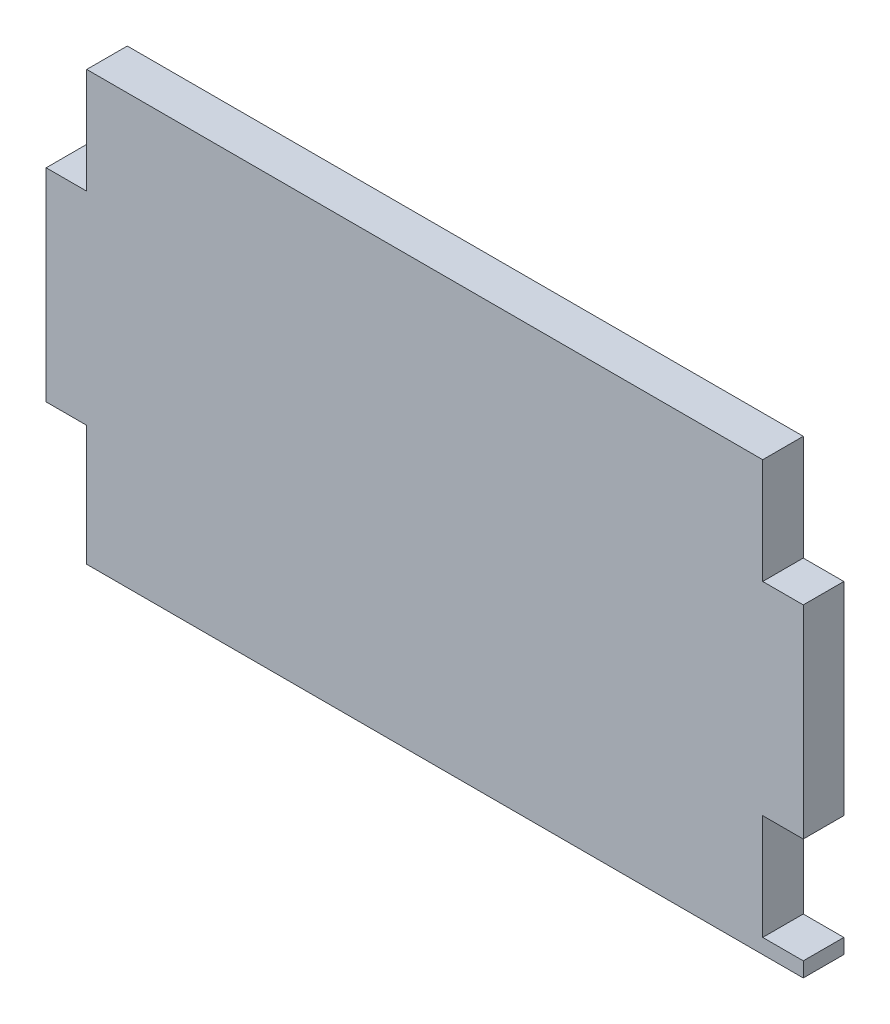
ISO-10303-21;
HEADER;
FILE_DESCRIPTION(('STEP AP214'),'2;1');
FILE_NAME('part.step','',(''),(''),'','','');
FILE_SCHEMA(('AUTOMOTIVE_DESIGN { 1 0 10303 214 1 1 1 1 }'));
ENDSEC;
DATA;
#1=APPLICATION_CONTEXT('core data for automotive mechanical design processes');
#2=APPLICATION_PROTOCOL_DEFINITION('international standard','automotive_design',2000,#1);
#3=PRODUCT_CONTEXT('',#1,'mechanical');
#4=PRODUCT('Part','Part','',(#3));
#5=PRODUCT_RELATED_PRODUCT_CATEGORY('part','',(#4));
#6=PRODUCT_DEFINITION_FORMATION('','',#4);
#7=PRODUCT_DEFINITION_CONTEXT('part definition',#1,'design');
#8=PRODUCT_DEFINITION('design','',#6,#7);
#9=PRODUCT_DEFINITION_SHAPE('','',#8);
#10=(LENGTH_UNIT() NAMED_UNIT(*) SI_UNIT(.MILLI.,.METRE.));
#11=(NAMED_UNIT(*) PLANE_ANGLE_UNIT() SI_UNIT($,.RADIAN.));
#12=(NAMED_UNIT(*) SI_UNIT($,.STERADIAN.) SOLID_ANGLE_UNIT());
#13=UNCERTAINTY_MEASURE_WITH_UNIT(LENGTH_MEASURE(1.E-05),#10,'distance_accuracy_value','');
#14=(GEOMETRIC_REPRESENTATION_CONTEXT(3) GLOBAL_UNCERTAINTY_ASSIGNED_CONTEXT((#13)) GLOBAL_UNIT_ASSIGNED_CONTEXT((#10,
#11,#12)) REPRESENTATION_CONTEXT('',''));
#15=CARTESIAN_POINT('',(0.,0.,0.));
#16=DIRECTION('',(0.,0.,1.));
#17=DIRECTION('',(1.,0.,0.));
#18=AXIS2_PLACEMENT_3D('',#15,#16,#17);
#19=CARTESIAN_POINT('',(15.0065393518519,16.5420138888889,3.));
#20=DIRECTION('',(-1.,0.,0.));
#21=DIRECTION('',(0.,-1.,0.));
#22=AXIS2_PLACEMENT_3D('',#19,#20,#21);
#23=PLANE('',#22);
#24=DIRECTION('',(0.,1.,0.));
#25=VECTOR('',#24,1.);
#26=CARTESIAN_POINT('',(15.0065393518519,16.5420138888889,3.));
#27=LINE('',#26,#25);
#28=CARTESIAN_POINT('',(15.0065393518519,-6.25798611111111,3.));
#29=VERTEX_POINT('',#28);
#30=CARTESIAN_POINT('',(15.0065393518519,8.74201388888889,3.));
#31=VERTEX_POINT('',#30);
#32=EDGE_CURVE('E160',#29,#31,#27,.T.);
#33=ORIENTED_EDGE('',*,*,#32,.F.);
#34=DIRECTION('',(0.,0.,1.));
#35=VECTOR('',#34,1.);
#36=CARTESIAN_POINT('',(15.0065393518519,-6.25798611111111,0.));
#37=LINE('',#36,#35);
#38=CARTESIAN_POINT('',(15.0065393518519,-6.25798611111111,0.));
#39=VERTEX_POINT('',#38);
#40=EDGE_CURVE('E227',#39,#29,#37,.T.);
#41=ORIENTED_EDGE('',*,*,#40,.F.);
#42=DIRECTION('',(0.,1.,0.));
#43=VECTOR('',#42,1.);
#44=CARTESIAN_POINT('',(15.0065393518519,16.5420138888889,0.));
#45=LINE('',#44,#43);
#46=CARTESIAN_POINT('',(15.0065393518519,8.74201388888889,0.));
#47=VERTEX_POINT('',#46);
#48=EDGE_CURVE('E56',#39,#47,#45,.T.);
#49=ORIENTED_EDGE('',*,*,#48,.T.);
#50=DIRECTION('',(0.,0.,1.));
#51=VECTOR('',#50,1.);
#52=CARTESIAN_POINT('',(15.0065393518519,8.74201388888889,0.));
#53=LINE('',#52,#51);
#54=EDGE_CURVE('E234',#47,#31,#53,.T.);
#55=ORIENTED_EDGE('',*,*,#54,.T.);
#56=EDGE_LOOP('',(#33,#41,#49,#55));
#57=FACE_BOUND('',#56,.T.);
#58=ADVANCED_FACE('F33',(#57),#23,.F.);
#59=CARTESIAN_POINT('',(-40.9934606481482,16.5420138888889,3.));
#60=DIRECTION('',(1.,0.,0.));
#61=DIRECTION('',(0.,0.,-1.));
#62=AXIS2_PLACEMENT_3D('',#59,#60,#61);
#63=PLANE('',#62);
#64=DIRECTION('',(0.,-1.,0.));
#65=VECTOR('',#64,1.);
#66=CARTESIAN_POINT('',(-40.9934606481482,16.5420138888889,0.));
#67=LINE('',#66,#65);
#68=CARTESIAN_POINT('',(-40.9934606481482,8.74201388888889,0.));
#69=VERTEX_POINT('',#68);
#70=CARTESIAN_POINT('',(-40.9934606481482,-6.25798611111111,0.));
#71=VERTEX_POINT('',#70);
#72=EDGE_CURVE('E170',#69,#71,#67,.T.);
#73=ORIENTED_EDGE('',*,*,#72,.T.);
#74=DIRECTION('',(0.,0.,1.));
#75=VECTOR('',#74,1.);
#76=CARTESIAN_POINT('',(-40.9934606481482,-6.25798611111111,0.));
#77=LINE('',#76,#75);
#78=CARTESIAN_POINT('',(-40.9934606481482,-6.25798611111111,3.));
#79=VERTEX_POINT('',#78);
#80=EDGE_CURVE('E209',#71,#79,#77,.T.);
#81=ORIENTED_EDGE('',*,*,#80,.T.);
#82=DIRECTION('',(0.,-1.,0.));
#83=VECTOR('',#82,1.);
#84=CARTESIAN_POINT('',(-40.9934606481482,16.5420138888889,3.));
#85=LINE('',#84,#83);
#86=CARTESIAN_POINT('',(-40.9934606481482,8.74201388888889,3.));
#87=VERTEX_POINT('',#86);
#88=EDGE_CURVE('E161',#87,#79,#85,.T.);
#89=ORIENTED_EDGE('',*,*,#88,.F.);
#90=DIRECTION('',(0.,0.,1.));
#91=VECTOR('',#90,1.);
#92=CARTESIAN_POINT('',(-40.9934606481482,8.74201388888889,0.));
#93=LINE('',#92,#91);
#94=EDGE_CURVE('E201',#69,#87,#93,.T.);
#95=ORIENTED_EDGE('',*,*,#94,.F.);
#96=EDGE_LOOP('',(#73,#81,#89,#95));
#97=FACE_BOUND('',#96,.T.);
#98=ADVANCED_FACE('F35',(#97),#63,.F.);
#99=CARTESIAN_POINT('',(-40.9934606481482,-15.1579861111111,3.));
#100=DIRECTION('',(0.,1.,0.));
#101=DIRECTION('',(0.,0.,1.));
#102=AXIS2_PLACEMENT_3D('',#99,#100,#101);
#103=PLANE('',#102);
#104=DIRECTION('',(1.,0.,0.));
#105=VECTOR('',#104,1.);
#106=CARTESIAN_POINT('',(-40.9934606481482,-15.1579861111111,3.));
#107=LINE('',#106,#105);
#108=CARTESIAN_POINT('',(-37.9934606481481,-15.1579861111111,3.));
#109=VERTEX_POINT('',#108);
#110=CARTESIAN_POINT('',(15.0065393518519,-15.1579861111111,3.));
#111=VERTEX_POINT('',#110);
#112=EDGE_CURVE('E142',#109,#111,#107,.T.);
#113=ORIENTED_EDGE('',*,*,#112,.F.);
#114=DIRECTION('',(0.,0.,1.));
#115=VECTOR('',#114,1.);
#116=CARTESIAN_POINT('',(-37.9934606481481,-15.1579861111111,-7.));
#117=LINE('',#116,#115);
#118=CARTESIAN_POINT('',(-37.9934606481481,-15.1579861111111,0.));
#119=VERTEX_POINT('',#118);
#120=EDGE_CURVE('E150',#119,#109,#117,.T.);
#121=ORIENTED_EDGE('',*,*,#120,.F.);
#122=DIRECTION('',(1.,0.,0.));
#123=VECTOR('',#122,1.);
#124=CARTESIAN_POINT('',(-40.9934606481482,-15.1579861111111,0.));
#125=LINE('',#124,#123);
#126=CARTESIAN_POINT('',(15.0065393518519,-15.1579861111111,0.));
#127=VERTEX_POINT('',#126);
#128=EDGE_CURVE('E173',#119,#127,#125,.T.);
#129=ORIENTED_EDGE('',*,*,#128,.T.);
#130=DIRECTION('',(0.,0.,-1.));
#131=VECTOR('',#130,1.);
#132=CARTESIAN_POINT('',(15.0065393518519,-15.1579861111111,3.));
#133=LINE('',#132,#131);
#134=EDGE_CURVE('E11',#111,#127,#133,.T.);
#135=ORIENTED_EDGE('',*,*,#134,.F.);
#136=EDGE_LOOP('',(#113,#121,#129,#135));
#137=FACE_BOUND('',#136,.T.);
#138=ADVANCED_FACE('F158',(#137),#103,.F.);
#139=CARTESIAN_POINT('',(15.0065393518519,-14.0579861111111,0.));
#140=VERTEX_POINT('',#139);
#141=EDGE_CURVE('E176',#127,#140,#45,.T.);
#142=ORIENTED_EDGE('',*,*,#141,.T.);
#143=DIRECTION('',(0.,0.,1.));
#144=VECTOR('',#143,1.);
#145=CARTESIAN_POINT('',(15.0065393518519,-14.0579861111111,0.));
#146=LINE('',#145,#144);
#147=CARTESIAN_POINT('',(15.0065393518519,-14.0579861111111,3.));
#148=VERTEX_POINT('',#147);
#149=EDGE_CURVE('E48',#140,#148,#146,.T.);
#150=ORIENTED_EDGE('',*,*,#149,.T.);
#151=EDGE_CURVE('E163',#111,#148,#27,.T.);
#152=ORIENTED_EDGE('',*,*,#151,.F.);
#153=ORIENTED_EDGE('',*,*,#134,.T.);
#154=EDGE_LOOP('',(#142,#150,#152,#153));
#155=FACE_BOUND('',#154,.T.);
#156=ADVANCED_FACE('F250',(#155),#23,.F.);
#157=CARTESIAN_POINT('',(-40.9934606481482,16.5420138888889,3.));
#158=DIRECTION('',(0.,-1.,0.));
#159=DIRECTION('',(0.,0.,-1.));
#160=AXIS2_PLACEMENT_3D('',#157,#158,#159);
#161=PLANE('',#160);
#162=DIRECTION('',(-1.,0.,0.));
#163=VECTOR('',#162,1.);
#164=CARTESIAN_POINT('',(-40.9934606481482,16.5420138888889,3.));
#165=LINE('',#164,#163);
#166=CARTESIAN_POINT('',(12.0065393518519,16.5420138888889,3.));
#167=VERTEX_POINT('',#166);
#168=CARTESIAN_POINT('',(-37.9934606481481,16.5420138888889,3.));
#169=VERTEX_POINT('',#168);
#170=EDGE_CURVE('E41',#167,#169,#165,.T.);
#171=ORIENTED_EDGE('',*,*,#170,.F.);
#172=DIRECTION('',(0.,0.,1.));
#173=VECTOR('',#172,1.);
#174=CARTESIAN_POINT('',(12.0065393518519,16.5420138888889,0.));
#175=LINE('',#174,#173);
#176=CARTESIAN_POINT('',(12.0065393518519,16.5420138888889,0.));
#177=VERTEX_POINT('',#176);
#178=EDGE_CURVE('E147',#177,#167,#175,.T.);
#179=ORIENTED_EDGE('',*,*,#178,.F.);
#180=DIRECTION('',(-1.,0.,0.));
#181=VECTOR('',#180,1.);
#182=CARTESIAN_POINT('',(-40.9934606481482,16.5420138888889,0.));
#183=LINE('',#182,#181);
#184=CARTESIAN_POINT('',(-37.9934606481481,16.5420138888889,0.));
#185=VERTEX_POINT('',#184);
#186=EDGE_CURVE('E165',#177,#185,#183,.T.);
#187=ORIENTED_EDGE('',*,*,#186,.T.);
#188=DIRECTION('',(0.,0.,1.));
#189=VECTOR('',#188,1.);
#190=CARTESIAN_POINT('',(-37.9934606481481,16.5420138888889,0.));
#191=LINE('',#190,#189);
#192=EDGE_CURVE('E174',#185,#169,#191,.T.);
#193=ORIENTED_EDGE('',*,*,#192,.T.);
#194=EDGE_LOOP('',(#171,#179,#187,#193));
#195=FACE_BOUND('',#194,.T.);
#196=ADVANCED_FACE('F184',(#195),#161,.F.);
#197=CARTESIAN_POINT('',(0.,0.,3.));
#198=DIRECTION('',(0.,0.,1.));
#199=DIRECTION('',(1.,0.,0.));
#200=AXIS2_PLACEMENT_3D('',#197,#198,#199);
#201=PLANE('',#200);
#202=DIRECTION('',(0.,1.,0.));
#203=VECTOR('',#202,1.);
#204=CARTESIAN_POINT('',(-37.9934606481481,-6.25798611111111,3.));
#205=LINE('',#204,#203);
#206=CARTESIAN_POINT('',(-37.9934606481481,-6.25798611111111,3.));
#207=VERTEX_POINT('',#206);
#208=EDGE_CURVE('E137',#109,#207,#205,.T.);
#209=ORIENTED_EDGE('',*,*,#208,.F.);
#210=ORIENTED_EDGE('',*,*,#112,.T.);
#211=ORIENTED_EDGE('',*,*,#151,.T.);
#212=DIRECTION('',(1.,0.,0.));
#213=VECTOR('',#212,1.);
#214=CARTESIAN_POINT('',(12.0065393518519,-14.0579861111111,3.));
#215=LINE('',#214,#213);
#216=CARTESIAN_POINT('',(12.0065393518519,-14.0579861111111,3.));
#217=VERTEX_POINT('',#216);
#218=EDGE_CURVE('E253',#217,#148,#215,.T.);
#219=ORIENTED_EDGE('',*,*,#218,.F.);
#220=DIRECTION('',(0.,-1.,0.));
#221=VECTOR('',#220,1.);
#222=CARTESIAN_POINT('',(12.0065393518519,-6.25798611111111,3.));
#223=LINE('',#222,#221);
#224=CARTESIAN_POINT('',(12.0065393518519,-6.25798611111111,3.));
#225=VERTEX_POINT('',#224);
#226=EDGE_CURVE('E156',#225,#217,#223,.T.);
#227=ORIENTED_EDGE('',*,*,#226,.F.);
#228=DIRECTION('',(-1.,0.,0.));
#229=VECTOR('',#228,1.);
#230=CARTESIAN_POINT('',(12.0065393518519,-6.25798611111111,3.));
#231=LINE('',#230,#229);
#232=EDGE_CURVE('E256',#29,#225,#231,.T.);
#233=ORIENTED_EDGE('',*,*,#232,.F.);
#234=ORIENTED_EDGE('',*,*,#32,.T.);
#235=DIRECTION('',(1.,0.,0.));
#236=VECTOR('',#235,1.);
#237=CARTESIAN_POINT('',(12.0065393518519,8.74201388888889,3.));
#238=LINE('',#237,#236);
#239=CARTESIAN_POINT('',(12.0065393518519,8.74201388888889,3.));
#240=VERTEX_POINT('',#239);
#241=EDGE_CURVE('E221',#240,#31,#238,.T.);
#242=ORIENTED_EDGE('',*,*,#241,.F.);
#243=DIRECTION('',(0.,-1.,0.));
#244=VECTOR('',#243,1.);
#245=CARTESIAN_POINT('',(12.0065393518519,16.5420138888889,3.));
#246=LINE('',#245,#244);
#247=EDGE_CURVE('E219',#167,#240,#246,.T.);
#248=ORIENTED_EDGE('',*,*,#247,.F.);
#249=ORIENTED_EDGE('',*,*,#170,.T.);
#250=DIRECTION('',(0.,1.,0.));
#251=VECTOR('',#250,1.);
#252=CARTESIAN_POINT('',(-37.9934606481481,16.5420138888889,3.));
#253=LINE('',#252,#251);
#254=CARTESIAN_POINT('',(-37.9934606481481,8.74201388888889,3.));
#255=VERTEX_POINT('',#254);
#256=EDGE_CURVE('E194',#255,#169,#253,.T.);
#257=ORIENTED_EDGE('',*,*,#256,.F.);
#258=DIRECTION('',(1.,0.,0.));
#259=VECTOR('',#258,1.);
#260=CARTESIAN_POINT('',(-40.9934606481482,8.74201388888889,3.));
#261=LINE('',#260,#259);
#262=EDGE_CURVE('E206',#87,#255,#261,.T.);
#263=ORIENTED_EDGE('',*,*,#262,.F.);
#264=ORIENTED_EDGE('',*,*,#88,.T.);
#265=DIRECTION('',(-1.,0.,0.));
#266=VECTOR('',#265,1.);
#267=CARTESIAN_POINT('',(-40.9934606481482,-6.25798611111111,3.));
#268=LINE('',#267,#266);
#269=EDGE_CURVE('E145',#207,#79,#268,.T.);
#270=ORIENTED_EDGE('',*,*,#269,.F.);
#271=EDGE_LOOP('',(#209,#210,#211,#219,#227,#233,#234,#242,#248,#249,#257,#263,#264,#270));
#272=FACE_BOUND('',#271,.T.);
#273=ADVANCED_FACE('F139',(#272),#201,.T.);
#274=CARTESIAN_POINT('',(0.,0.,0.));
#275=DIRECTION('',(0.,0.,1.));
#276=DIRECTION('',(1.,0.,0.));
#277=AXIS2_PLACEMENT_3D('',#274,#275,#276);
#278=PLANE('',#277);
#279=ORIENTED_EDGE('',*,*,#128,.F.);
#280=DIRECTION('',(0.,1.,0.));
#281=VECTOR('',#280,1.);
#282=CARTESIAN_POINT('',(-37.9934606481481,-6.25798611111111,0.));
#283=LINE('',#282,#281);
#284=CARTESIAN_POINT('',(-37.9934606481481,-6.25798611111111,0.));
#285=VERTEX_POINT('',#284);
#286=EDGE_CURVE('E153',#119,#285,#283,.T.);
#287=ORIENTED_EDGE('',*,*,#286,.T.);
#288=DIRECTION('',(-1.,0.,0.));
#289=VECTOR('',#288,1.);
#290=CARTESIAN_POINT('',(-40.9934606481482,-6.25798611111111,0.));
#291=LINE('',#290,#289);
#292=EDGE_CURVE('E239',#285,#71,#291,.T.);
#293=ORIENTED_EDGE('',*,*,#292,.T.);
#294=ORIENTED_EDGE('',*,*,#72,.F.);
#295=DIRECTION('',(1.,0.,0.));
#296=VECTOR('',#295,1.);
#297=CARTESIAN_POINT('',(-40.9934606481482,8.74201388888889,0.));
#298=LINE('',#297,#296);
#299=CARTESIAN_POINT('',(-37.9934606481481,8.74201388888889,0.));
#300=VERTEX_POINT('',#299);
#301=EDGE_CURVE('E200',#69,#300,#298,.T.);
#302=ORIENTED_EDGE('',*,*,#301,.T.);
#303=DIRECTION('',(0.,1.,0.));
#304=VECTOR('',#303,1.);
#305=CARTESIAN_POINT('',(-37.9934606481481,16.5420138888889,0.));
#306=LINE('',#305,#304);
#307=EDGE_CURVE('E191',#300,#185,#306,.T.);
#308=ORIENTED_EDGE('',*,*,#307,.T.);
#309=ORIENTED_EDGE('',*,*,#186,.F.);
#310=DIRECTION('',(0.,-1.,0.));
#311=VECTOR('',#310,1.);
#312=CARTESIAN_POINT('',(12.0065393518519,16.5420138888889,0.));
#313=LINE('',#312,#311);
#314=CARTESIAN_POINT('',(12.0065393518519,8.74201388888889,0.));
#315=VERTEX_POINT('',#314);
#316=EDGE_CURVE('E225',#177,#315,#313,.T.);
#317=ORIENTED_EDGE('',*,*,#316,.T.);
#318=DIRECTION('',(1.,0.,0.));
#319=VECTOR('',#318,1.);
#320=CARTESIAN_POINT('',(12.0065393518519,8.74201388888889,0.));
#321=LINE('',#320,#319);
#322=EDGE_CURVE('E230',#315,#47,#321,.T.);
#323=ORIENTED_EDGE('',*,*,#322,.T.);
#324=ORIENTED_EDGE('',*,*,#48,.F.);
#325=DIRECTION('',(-1.,0.,0.));
#326=VECTOR('',#325,1.);
#327=CARTESIAN_POINT('',(12.0065393518519,-6.25798611111111,0.));
#328=LINE('',#327,#326);
#329=CARTESIAN_POINT('',(12.0065393518519,-6.25798611111111,0.));
#330=VERTEX_POINT('',#329);
#331=EDGE_CURVE('E267',#39,#330,#328,.T.);
#332=ORIENTED_EDGE('',*,*,#331,.T.);
#333=DIRECTION('',(0.,-1.,0.));
#334=VECTOR('',#333,1.);
#335=CARTESIAN_POINT('',(12.0065393518519,-6.25798611111111,0.));
#336=LINE('',#335,#334);
#337=CARTESIAN_POINT('',(12.0065393518519,-14.0579861111111,0.));
#338=VERTEX_POINT('',#337);
#339=EDGE_CURVE('E259',#330,#338,#336,.T.);
#340=ORIENTED_EDGE('',*,*,#339,.T.);
#341=DIRECTION('',(1.,0.,0.));
#342=VECTOR('',#341,1.);
#343=CARTESIAN_POINT('',(12.0065393518519,-14.0579861111111,0.));
#344=LINE('',#343,#342);
#345=EDGE_CURVE('E278',#338,#140,#344,.T.);
#346=ORIENTED_EDGE('',*,*,#345,.T.);
#347=ORIENTED_EDGE('',*,*,#141,.F.);
#348=EDGE_LOOP('',(#279,#287,#293,#294,#302,#308,#309,#317,#323,#324,#332,#340,#346,#347));
#349=FACE_BOUND('',#348,.T.);
#350=ADVANCED_FACE('F198',(#349),#278,.F.);
#351=CARTESIAN_POINT('',(-37.9934606481481,16.5420138888889,0.));
#352=DIRECTION('',(1.,0.,0.));
#353=DIRECTION('',(0.,0.,-1.));
#354=AXIS2_PLACEMENT_3D('',#351,#352,#353);
#355=PLANE('',#354);
#356=ORIENTED_EDGE('',*,*,#256,.T.);
#357=ORIENTED_EDGE('',*,*,#192,.F.);
#358=ORIENTED_EDGE('',*,*,#307,.F.);
#359=DIRECTION('',(0.,0.,1.));
#360=VECTOR('',#359,1.);
#361=CARTESIAN_POINT('',(-37.9934606481481,8.74201388888889,0.));
#362=LINE('',#361,#360);
#363=EDGE_CURVE('E195',#300,#255,#362,.T.);
#364=ORIENTED_EDGE('',*,*,#363,.T.);
#365=EDGE_LOOP('',(#356,#357,#358,#364));
#366=FACE_BOUND('',#365,.T.);
#367=ADVANCED_FACE('F190',(#366),#355,.F.);
#368=CARTESIAN_POINT('',(-40.9934606481482,8.74201388888889,0.));
#369=DIRECTION('',(0.,-1.,0.));
#370=DIRECTION('',(0.,0.,-1.));
#371=AXIS2_PLACEMENT_3D('',#368,#369,#370);
#372=PLANE('',#371);
#373=ORIENTED_EDGE('',*,*,#262,.T.);
#374=ORIENTED_EDGE('',*,*,#363,.F.);
#375=ORIENTED_EDGE('',*,*,#301,.F.);
#376=ORIENTED_EDGE('',*,*,#94,.T.);
#377=EDGE_LOOP('',(#373,#374,#375,#376));
#378=FACE_BOUND('',#377,.T.);
#379=ADVANCED_FACE('F213',(#378),#372,.F.);
#380=CARTESIAN_POINT('',(-40.9934606481482,-6.25798611111111,0.));
#381=DIRECTION('',(0.,1.,0.));
#382=DIRECTION('',(0.,0.,1.));
#383=AXIS2_PLACEMENT_3D('',#380,#381,#382);
#384=PLANE('',#383);
#385=ORIENTED_EDGE('',*,*,#269,.T.);
#386=ORIENTED_EDGE('',*,*,#80,.F.);
#387=ORIENTED_EDGE('',*,*,#292,.F.);
#388=DIRECTION('',(0.,0.,1.));
#389=VECTOR('',#388,1.);
#390=CARTESIAN_POINT('',(-37.9934606481481,-6.25798611111111,0.));
#391=LINE('',#390,#389);
#392=EDGE_CURVE('E241',#285,#207,#391,.T.);
#393=ORIENTED_EDGE('',*,*,#392,.T.);
#394=EDGE_LOOP('',(#385,#386,#387,#393));
#395=FACE_BOUND('',#394,.T.);
#396=ADVANCED_FACE('F247',(#395),#384,.F.);
#397=CARTESIAN_POINT('',(-37.9934606481481,-6.25798611111111,0.));
#398=DIRECTION('',(1.,0.,0.));
#399=DIRECTION('',(0.,0.,-1.));
#400=AXIS2_PLACEMENT_3D('',#397,#398,#399);
#401=PLANE('',#400);
#402=ORIENTED_EDGE('',*,*,#208,.T.);
#403=ORIENTED_EDGE('',*,*,#392,.F.);
#404=ORIENTED_EDGE('',*,*,#286,.F.);
#405=ORIENTED_EDGE('',*,*,#120,.T.);
#406=EDGE_LOOP('',(#402,#403,#404,#405));
#407=FACE_BOUND('',#406,.T.);
#408=ADVANCED_FACE('F151',(#407),#401,.F.);
#409=CARTESIAN_POINT('',(12.0065393518519,16.5420138888889,0.));
#410=DIRECTION('',(-1.,0.,0.));
#411=DIRECTION('',(0.,-1.,0.));
#412=AXIS2_PLACEMENT_3D('',#409,#410,#411);
#413=PLANE('',#412);
#414=ORIENTED_EDGE('',*,*,#247,.T.);
#415=DIRECTION('',(0.,0.,1.));
#416=VECTOR('',#415,1.);
#417=CARTESIAN_POINT('',(12.0065393518519,8.74201388888889,0.));
#418=LINE('',#417,#416);
#419=EDGE_CURVE('E236',#315,#240,#418,.T.);
#420=ORIENTED_EDGE('',*,*,#419,.F.);
#421=ORIENTED_EDGE('',*,*,#316,.F.);
#422=ORIENTED_EDGE('',*,*,#178,.T.);
#423=EDGE_LOOP('',(#414,#420,#421,#422));
#424=FACE_BOUND('',#423,.T.);
#425=ADVANCED_FACE('F327',(#424),#413,.F.);
#426=CARTESIAN_POINT('',(12.0065393518519,8.74201388888889,0.));
#427=DIRECTION('',(0.,-1.,0.));
#428=DIRECTION('',(1.,0.,0.));
#429=AXIS2_PLACEMENT_3D('',#426,#427,#428);
#430=PLANE('',#429);
#431=ORIENTED_EDGE('',*,*,#241,.T.);
#432=ORIENTED_EDGE('',*,*,#54,.F.);
#433=ORIENTED_EDGE('',*,*,#322,.F.);
#434=ORIENTED_EDGE('',*,*,#419,.T.);
#435=EDGE_LOOP('',(#431,#432,#433,#434));
#436=FACE_BOUND('',#435,.T.);
#437=ADVANCED_FACE('F272',(#436),#430,.F.);
#438=CARTESIAN_POINT('',(12.0065393518519,-6.25798611111111,0.));
#439=DIRECTION('',(-1.,0.,0.));
#440=DIRECTION('',(0.,-1.,0.));
#441=AXIS2_PLACEMENT_3D('',#438,#439,#440);
#442=PLANE('',#441);
#443=ORIENTED_EDGE('',*,*,#226,.T.);
#444=DIRECTION('',(0.,0.,1.));
#445=VECTOR('',#444,1.);
#446=CARTESIAN_POINT('',(12.0065393518519,-14.0579861111111,0.));
#447=LINE('',#446,#445);
#448=EDGE_CURVE('E266',#338,#217,#447,.T.);
#449=ORIENTED_EDGE('',*,*,#448,.F.);
#450=ORIENTED_EDGE('',*,*,#339,.F.);
#451=DIRECTION('',(0.,0.,1.));
#452=VECTOR('',#451,1.);
#453=CARTESIAN_POINT('',(12.0065393518519,-6.25798611111111,0.));
#454=LINE('',#453,#452);
#455=EDGE_CURVE('E223',#330,#225,#454,.T.);
#456=ORIENTED_EDGE('',*,*,#455,.T.);
#457=EDGE_LOOP('',(#443,#449,#450,#456));
#458=FACE_BOUND('',#457,.T.);
#459=ADVANCED_FACE('F282',(#458),#442,.F.);
#460=CARTESIAN_POINT('',(12.0065393518519,-6.25798611111111,0.));
#461=DIRECTION('',(0.,1.,0.));
#462=DIRECTION('',(0.,0.,1.));
#463=AXIS2_PLACEMENT_3D('',#460,#461,#462);
#464=PLANE('',#463);
#465=ORIENTED_EDGE('',*,*,#232,.T.);
#466=ORIENTED_EDGE('',*,*,#455,.F.);
#467=ORIENTED_EDGE('',*,*,#331,.F.);
#468=ORIENTED_EDGE('',*,*,#40,.T.);
#469=EDGE_LOOP('',(#465,#466,#467,#468));
#470=FACE_BOUND('',#469,.T.);
#471=ADVANCED_FACE('F275',(#470),#464,.F.);
#472=CARTESIAN_POINT('',(12.0065393518519,-14.0579861111111,0.));
#473=DIRECTION('',(0.,-1.,0.));
#474=DIRECTION('',(1.,0.,0.));
#475=AXIS2_PLACEMENT_3D('',#472,#473,#474);
#476=PLANE('',#475);
#477=ORIENTED_EDGE('',*,*,#218,.T.);
#478=ORIENTED_EDGE('',*,*,#149,.F.);
#479=ORIENTED_EDGE('',*,*,#345,.F.);
#480=ORIENTED_EDGE('',*,*,#448,.T.);
#481=EDGE_LOOP('',(#477,#478,#479,#480));
#482=FACE_BOUND('',#481,.T.);
#483=ADVANCED_FACE('F283',(#482),#476,.F.);
#484=CLOSED_SHELL('',(#58,#98,#138,#156,#196,#273,#350,#367,#379,#396,#408,#425,#437,#459,#471,#483));
#485=MANIFOLD_SOLID_BREP('B2',#484);
#486=ADVANCED_BREP_SHAPE_REPRESENTATION('',(#18,#485),#14);
#487=SHAPE_DEFINITION_REPRESENTATION(#9,#486);
ENDSEC;
END-ISO-10303-21;
